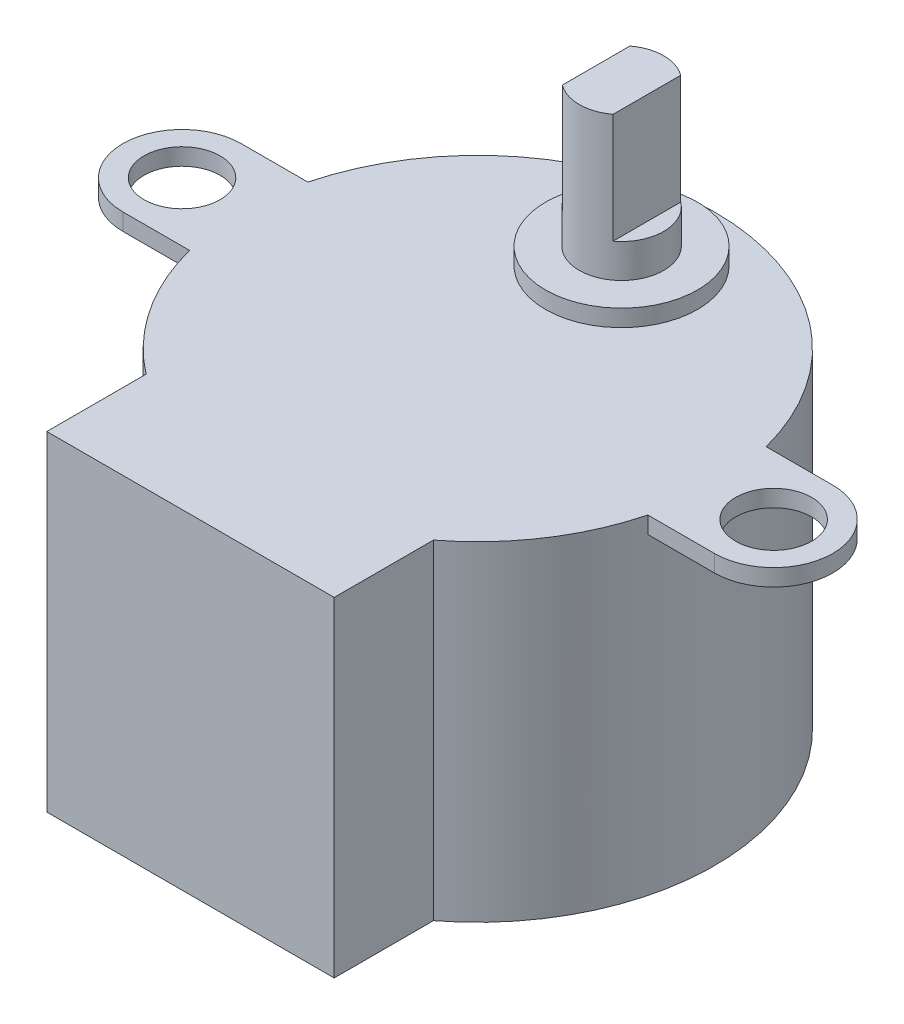
ISO-10303-21;
HEADER;
FILE_DESCRIPTION(('STEP AP214'),'2;1');
FILE_NAME('part.step','',(''),(''),'','','');
FILE_SCHEMA(('AUTOMOTIVE_DESIGN { 1 0 10303 214 1 1 1 1 }'));
ENDSEC;
DATA;
#1=APPLICATION_CONTEXT('core data for automotive mechanical design processes');
#2=APPLICATION_PROTOCOL_DEFINITION('international standard','automotive_design',2000,#1);
#3=PRODUCT_CONTEXT('',#1,'mechanical');
#4=PRODUCT('Part','Part','',(#3));
#5=PRODUCT_RELATED_PRODUCT_CATEGORY('part','',(#4));
#6=PRODUCT_DEFINITION_FORMATION('','',#4);
#7=PRODUCT_DEFINITION_CONTEXT('part definition',#1,'design');
#8=PRODUCT_DEFINITION('design','',#6,#7);
#9=PRODUCT_DEFINITION_SHAPE('','',#8);
#10=(LENGTH_UNIT() NAMED_UNIT(*) SI_UNIT(.MILLI.,.METRE.));
#11=(NAMED_UNIT(*) PLANE_ANGLE_UNIT() SI_UNIT($,.RADIAN.));
#12=(NAMED_UNIT(*) SI_UNIT($,.STERADIAN.) SOLID_ANGLE_UNIT());
#13=UNCERTAINTY_MEASURE_WITH_UNIT(LENGTH_MEASURE(1.E-05),#10,'distance_accuracy_value','');
#14=(GEOMETRIC_REPRESENTATION_CONTEXT(3) GLOBAL_UNCERTAINTY_ASSIGNED_CONTEXT((#13)) GLOBAL_UNIT_ASSIGNED_CONTEXT((#10,
#11,#12)) REPRESENTATION_CONTEXT('',''));
#15=CARTESIAN_POINT('',(0.,0.,0.));
#16=DIRECTION('',(0.,0.,1.));
#17=DIRECTION('',(1.,0.,0.));
#18=AXIS2_PLACEMENT_3D('',#15,#16,#17);
#19=CARTESIAN_POINT('',(0.,22.5,-8.5));
#20=DIRECTION('',(0.,1.,0.));
#21=DIRECTION('',(0.,0.,1.));
#22=AXIS2_PLACEMENT_3D('',#19,#20,#21);
#23=PLANE('',#22);
#24=CARTESIAN_POINT('',(0.,22.5,-8.5));
#25=DIRECTION('',(0.,1.,0.));
#26=DIRECTION('',(0.,0.,1.));
#27=AXIS2_PLACEMENT_3D('',#24,#25,#26);
#28=CIRCLE('',#27,2.5);
#29=CARTESIAN_POINT('',(1.5,22.5,-6.5));
#30=VERTEX_POINT('',#29);
#31=CARTESIAN_POINT('',(1.5,22.5,-10.5));
#32=VERTEX_POINT('',#31);
#33=EDGE_CURVE('E93',#30,#32,#28,.T.);
#34=ORIENTED_EDGE('',*,*,#33,.T.);
#35=DIRECTION('',(0.,0.,1.));
#36=VECTOR('',#35,1.);
#37=CARTESIAN_POINT('',(1.5,22.5,-8.5));
#38=LINE('',#37,#36);
#39=EDGE_CURVE('E203',#32,#30,#38,.T.);
#40=ORIENTED_EDGE('',*,*,#39,.T.);
#41=EDGE_LOOP('',(#34,#40));
#42=FACE_BOUND('',#41,.T.);
#43=ADVANCED_FACE('F71',(#42),#23,.T.);
#44=CARTESIAN_POINT('',(0.,19.5,0.));
#45=DIRECTION('',(0.,-1.,0.));
#46=DIRECTION('',(0.,0.,-1.));
#47=AXIS2_PLACEMENT_3D('',#44,#45,#46);
#48=CYLINDRICAL_SURFACE('',#47,14.);
#49=CARTESIAN_POINT('',(0.,19.5,0.));
#50=DIRECTION('',(0.,1.,0.));
#51=DIRECTION('',(0.,0.,1.));
#52=AXIS2_PLACEMENT_3D('',#49,#50,#51);
#53=CIRCLE('',#52,14.);
#54=CARTESIAN_POINT('',(-13.555441711726,19.5,3.5));
#55=VERTEX_POINT('',#54);
#56=CARTESIAN_POINT('',(-8.5,19.5,11.1242977306435));
#57=VERTEX_POINT('',#56);
#58=EDGE_CURVE('E292',#55,#57,#53,.T.);
#59=ORIENTED_EDGE('',*,*,#58,.F.);
#60=DIRECTION('',(0.,1.,0.));
#61=VECTOR('',#60,1.);
#62=CARTESIAN_POINT('',(-13.555441711726,18.5,3.5));
#63=LINE('',#62,#61);
#64=CARTESIAN_POINT('',(-13.555441711726,18.5,3.5));
#65=VERTEX_POINT('',#64);
#66=EDGE_CURVE('E250',#65,#55,#63,.T.);
#67=ORIENTED_EDGE('',*,*,#66,.F.);
#68=CARTESIAN_POINT('',(0.,18.5,0.));
#69=DIRECTION('',(0.,1.,0.));
#70=DIRECTION('',(0.,0.,1.));
#71=AXIS2_PLACEMENT_3D('',#68,#69,#70);
#72=CIRCLE('',#71,14.);
#73=CARTESIAN_POINT('',(-13.555441711726,18.5,-3.5));
#74=VERTEX_POINT('',#73);
#75=EDGE_CURVE('E227',#74,#65,#72,.T.);
#76=ORIENTED_EDGE('',*,*,#75,.F.);
#77=DIRECTION('',(0.,1.,0.));
#78=VECTOR('',#77,1.);
#79=CARTESIAN_POINT('',(-13.555441711726,18.5,-3.5));
#80=LINE('',#79,#78);
#81=CARTESIAN_POINT('',(-13.555441711726,19.5,-3.5));
#82=VERTEX_POINT('',#81);
#83=EDGE_CURVE('E238',#74,#82,#80,.T.);
#84=ORIENTED_EDGE('',*,*,#83,.T.);
#85=CARTESIAN_POINT('',(13.555441711726,19.5,-3.5));
#86=VERTEX_POINT('',#85);
#87=EDGE_CURVE('E298',#86,#82,#53,.T.);
#88=ORIENTED_EDGE('',*,*,#87,.F.);
#89=DIRECTION('',(0.,1.,0.));
#90=VECTOR('',#89,1.);
#91=CARTESIAN_POINT('',(13.555441711726,18.5,-3.5));
#92=LINE('',#91,#90);
#93=CARTESIAN_POINT('',(13.555441711726,18.5,-3.5));
#94=VERTEX_POINT('',#93);
#95=EDGE_CURVE('E271',#94,#86,#92,.T.);
#96=ORIENTED_EDGE('',*,*,#95,.F.);
#97=CARTESIAN_POINT('',(0.,18.5,0.));
#98=DIRECTION('',(0.,1.,0.));
#99=DIRECTION('',(0.,0.,1.));
#100=AXIS2_PLACEMENT_3D('',#97,#98,#99);
#101=CIRCLE('',#100,14.);
#102=CARTESIAN_POINT('',(13.555441711726,18.5,3.5));
#103=VERTEX_POINT('',#102);
#104=EDGE_CURVE('E269',#103,#94,#101,.T.);
#105=ORIENTED_EDGE('',*,*,#104,.F.);
#106=DIRECTION('',(0.,1.,0.));
#107=VECTOR('',#106,1.);
#108=CARTESIAN_POINT('',(13.555441711726,18.5,3.5));
#109=LINE('',#108,#107);
#110=CARTESIAN_POINT('',(13.555441711726,19.5,3.5));
#111=VERTEX_POINT('',#110);
#112=EDGE_CURVE('E281',#103,#111,#109,.T.);
#113=ORIENTED_EDGE('',*,*,#112,.T.);
#114=CARTESIAN_POINT('',(8.5,19.5,11.1242977306435));
#115=VERTEX_POINT('',#114);
#116=EDGE_CURVE('E294',#115,#111,#53,.T.);
#117=ORIENTED_EDGE('',*,*,#116,.F.);
#118=DIRECTION('',(0.,-1.,0.));
#119=VECTOR('',#118,1.);
#120=CARTESIAN_POINT('',(8.5,19.5,11.1242977306435));
#121=LINE('',#120,#119);
#122=CARTESIAN_POINT('',(8.5,0.,11.1242977306435));
#123=VERTEX_POINT('',#122);
#124=EDGE_CURVE('E75',#115,#123,#121,.T.);
#125=ORIENTED_EDGE('',*,*,#124,.T.);
#126=CARTESIAN_POINT('',(0.,0.,0.));
#127=DIRECTION('',(0.,1.,0.));
#128=DIRECTION('',(0.,0.,1.));
#129=AXIS2_PLACEMENT_3D('',#126,#127,#128);
#130=CIRCLE('',#129,14.);
#131=CARTESIAN_POINT('',(-8.5,0.,11.1242977306435));
#132=VERTEX_POINT('',#131);
#133=EDGE_CURVE('E307',#123,#132,#130,.T.);
#134=ORIENTED_EDGE('',*,*,#133,.T.);
#135=DIRECTION('',(0.,-1.,0.));
#136=VECTOR('',#135,1.);
#137=CARTESIAN_POINT('',(-8.5,19.5,11.1242977306435));
#138=LINE('',#137,#136);
#139=EDGE_CURVE('E317',#57,#132,#138,.T.);
#140=ORIENTED_EDGE('',*,*,#139,.F.);
#141=EDGE_LOOP('',(#59,#67,#76,#84,#88,#96,#105,#113,#117,#125,#134,#140));
#142=FACE_BOUND('',#141,.T.);
#143=ADVANCED_FACE('F325',(#142),#48,.T.);
#144=CARTESIAN_POINT('',(8.5,19.5,0.));
#145=DIRECTION('',(-1.,0.,0.));
#146=DIRECTION('',(0.,0.,1.));
#147=AXIS2_PLACEMENT_3D('',#144,#145,#146);
#148=PLANE('',#147);
#149=DIRECTION('',(0.,0.,-1.));
#150=VECTOR('',#149,1.);
#151=CARTESIAN_POINT('',(8.5,0.,0.));
#152=LINE('',#151,#150);
#153=CARTESIAN_POINT('',(8.5,0.,17.));
#154=VERTEX_POINT('',#153);
#155=EDGE_CURVE('E288',#154,#123,#152,.T.);
#156=ORIENTED_EDGE('',*,*,#155,.T.);
#157=ORIENTED_EDGE('',*,*,#124,.F.);
#158=DIRECTION('',(0.,0.,-1.));
#159=VECTOR('',#158,1.);
#160=CARTESIAN_POINT('',(8.5,19.5,0.));
#161=LINE('',#160,#159);
#162=CARTESIAN_POINT('',(8.5,19.5,17.));
#163=VERTEX_POINT('',#162);
#164=EDGE_CURVE('E289',#163,#115,#161,.T.);
#165=ORIENTED_EDGE('',*,*,#164,.F.);
#166=DIRECTION('',(0.,-1.,0.));
#167=VECTOR('',#166,1.);
#168=CARTESIAN_POINT('',(8.5,19.5,17.));
#169=LINE('',#168,#167);
#170=EDGE_CURVE('E304',#163,#154,#169,.T.);
#171=ORIENTED_EDGE('',*,*,#170,.T.);
#172=EDGE_LOOP('',(#156,#157,#165,#171));
#173=FACE_BOUND('',#172,.T.);
#174=ADVANCED_FACE('F73',(#173),#148,.F.);
#175=CARTESIAN_POINT('',(-8.5,19.5,0.));
#176=DIRECTION('',(-1.,0.,0.));
#177=DIRECTION('',(0.,0.,1.));
#178=AXIS2_PLACEMENT_3D('',#175,#176,#177);
#179=PLANE('',#178);
#180=DIRECTION('',(0.,0.,-1.));
#181=VECTOR('',#180,1.);
#182=CARTESIAN_POINT('',(-8.5,0.,0.));
#183=LINE('',#182,#181);
#184=CARTESIAN_POINT('',(-8.5,0.,17.));
#185=VERTEX_POINT('',#184);
#186=EDGE_CURVE('E310',#185,#132,#183,.T.);
#187=ORIENTED_EDGE('',*,*,#186,.F.);
#188=DIRECTION('',(0.,-1.,0.));
#189=VECTOR('',#188,1.);
#190=CARTESIAN_POINT('',(-8.5,19.5,17.));
#191=LINE('',#190,#189);
#192=CARTESIAN_POINT('',(-8.5,19.5,17.));
#193=VERTEX_POINT('',#192);
#194=EDGE_CURVE('E316',#193,#185,#191,.T.);
#195=ORIENTED_EDGE('',*,*,#194,.F.);
#196=DIRECTION('',(0.,0.,-1.));
#197=VECTOR('',#196,1.);
#198=CARTESIAN_POINT('',(-8.5,19.5,0.));
#199=LINE('',#198,#197);
#200=EDGE_CURVE('E297',#193,#57,#199,.T.);
#201=ORIENTED_EDGE('',*,*,#200,.T.);
#202=ORIENTED_EDGE('',*,*,#139,.T.);
#203=EDGE_LOOP('',(#187,#195,#201,#202));
#204=FACE_BOUND('',#203,.T.);
#205=ADVANCED_FACE('F336',(#204),#179,.T.);
#206=CARTESIAN_POINT('',(0.,19.5,17.));
#207=DIRECTION('',(0.,0.,1.));
#208=DIRECTION('',(1.,0.,0.));
#209=AXIS2_PLACEMENT_3D('',#206,#207,#208);
#210=PLANE('',#209);
#211=DIRECTION('',(-1.,0.,0.));
#212=VECTOR('',#211,1.);
#213=CARTESIAN_POINT('',(0.,0.,17.));
#214=LINE('',#213,#212);
#215=EDGE_CURVE('E293',#154,#185,#214,.T.);
#216=ORIENTED_EDGE('',*,*,#215,.F.);
#217=ORIENTED_EDGE('',*,*,#170,.F.);
#218=DIRECTION('',(-1.,0.,0.));
#219=VECTOR('',#218,1.);
#220=CARTESIAN_POINT('',(0.,19.5,17.));
#221=LINE('',#220,#219);
#222=EDGE_CURVE('E301',#163,#193,#221,.T.);
#223=ORIENTED_EDGE('',*,*,#222,.T.);
#224=ORIENTED_EDGE('',*,*,#194,.T.);
#225=EDGE_LOOP('',(#216,#217,#223,#224));
#226=FACE_BOUND('',#225,.T.);
#227=ADVANCED_FACE('F333',(#226),#210,.T.);
#228=CARTESIAN_POINT('',(0.,19.5,0.));
#229=DIRECTION('',(0.,1.,0.));
#230=DIRECTION('',(0.,0.,1.));
#231=AXIS2_PLACEMENT_3D('',#228,#229,#230);
#232=PLANE('',#231);
#233=CARTESIAN_POINT('',(0.,19.5,-8.5));
#234=DIRECTION('',(0.,1.,0.));
#235=DIRECTION('',(0.,0.,1.));
#236=AXIS2_PLACEMENT_3D('',#233,#234,#235);
#237=CIRCLE('',#236,4.5);
#238=CARTESIAN_POINT('',(0.,19.5,-4.));
#239=VERTEX_POINT('',#238);
#240=EDGE_CURVE('E213',#239,#239,#237,.T.);
#241=ORIENTED_EDGE('',*,*,#240,.F.);
#242=EDGE_LOOP('',(#241));
#243=FACE_BOUND('',#242,.T.);
#244=ORIENTED_EDGE('',*,*,#164,.T.);
#245=ORIENTED_EDGE('',*,*,#116,.T.);
#246=DIRECTION('',(1.,0.,0.));
#247=VECTOR('',#246,1.);
#248=CARTESIAN_POINT('',(0.,19.5,3.5));
#249=LINE('',#248,#247);
#250=CARTESIAN_POINT('',(17.5,19.5,3.5));
#251=VERTEX_POINT('',#250);
#252=EDGE_CURVE('E263',#111,#251,#249,.T.);
#253=ORIENTED_EDGE('',*,*,#252,.T.);
#254=CARTESIAN_POINT('',(17.5,19.5,0.));
#255=DIRECTION('',(0.,1.,0.));
#256=DIRECTION('',(0.,0.,1.));
#257=AXIS2_PLACEMENT_3D('',#254,#255,#256);
#258=CIRCLE('',#257,3.5);
#259=CARTESIAN_POINT('',(17.5,19.5,-3.5));
#260=VERTEX_POINT('',#259);
#261=EDGE_CURVE('E274',#251,#260,#258,.T.);
#262=ORIENTED_EDGE('',*,*,#261,.T.);
#263=DIRECTION('',(1.,0.,0.));
#264=VECTOR('',#263,1.);
#265=CARTESIAN_POINT('',(0.,19.5,-3.5));
#266=LINE('',#265,#264);
#267=EDGE_CURVE('E257',#86,#260,#266,.T.);
#268=ORIENTED_EDGE('',*,*,#267,.F.);
#269=ORIENTED_EDGE('',*,*,#87,.T.);
#270=DIRECTION('',(1.,0.,0.));
#271=VECTOR('',#270,1.);
#272=CARTESIAN_POINT('',(0.,19.5,-3.5));
#273=LINE('',#272,#271);
#274=CARTESIAN_POINT('',(-17.5,19.5,-3.5));
#275=VERTEX_POINT('',#274);
#276=EDGE_CURVE('E230',#275,#82,#273,.T.);
#277=ORIENTED_EDGE('',*,*,#276,.F.);
#278=CARTESIAN_POINT('',(-17.5,19.5,0.));
#279=DIRECTION('',(0.,1.,0.));
#280=DIRECTION('',(0.,0.,1.));
#281=AXIS2_PLACEMENT_3D('',#278,#279,#280);
#282=CIRCLE('',#281,3.5);
#283=CARTESIAN_POINT('',(-17.5,19.5,3.5));
#284=VERTEX_POINT('',#283);
#285=EDGE_CURVE('E240',#275,#284,#282,.T.);
#286=ORIENTED_EDGE('',*,*,#285,.T.);
#287=DIRECTION('',(1.,0.,0.));
#288=VECTOR('',#287,1.);
#289=CARTESIAN_POINT('',(0.,19.5,3.5));
#290=LINE('',#289,#288);
#291=EDGE_CURVE('E224',#284,#55,#290,.T.);
#292=ORIENTED_EDGE('',*,*,#291,.T.);
#293=ORIENTED_EDGE('',*,*,#58,.T.);
#294=ORIENTED_EDGE('',*,*,#200,.F.);
#295=ORIENTED_EDGE('',*,*,#222,.F.);
#296=EDGE_LOOP('',(#244,#245,#253,#262,#268,#269,#277,#286,#292,#293,#294,#295));
#297=FACE_BOUND('',#296,.T.);
#298=CARTESIAN_POINT('',(17.5,19.5,0.));
#299=DIRECTION('',(0.,1.,0.));
#300=DIRECTION('',(0.,0.,1.));
#301=AXIS2_PLACEMENT_3D('',#298,#299,#300);
#302=CIRCLE('',#301,2.25);
#303=CARTESIAN_POINT('',(17.5,19.5,2.25));
#304=VERTEX_POINT('',#303);
#305=EDGE_CURVE('E253',#304,#304,#302,.T.);
#306=ORIENTED_EDGE('',*,*,#305,.F.);
#307=EDGE_LOOP('',(#306));
#308=FACE_BOUND('',#307,.T.);
#309=CARTESIAN_POINT('',(-17.5,19.5,0.));
#310=DIRECTION('',(0.,1.,0.));
#311=DIRECTION('',(0.,0.,1.));
#312=AXIS2_PLACEMENT_3D('',#309,#310,#311);
#313=CIRCLE('',#312,2.25);
#314=CARTESIAN_POINT('',(-17.5,19.5,2.25));
#315=VERTEX_POINT('',#314);
#316=EDGE_CURVE('E218',#315,#315,#313,.T.);
#317=ORIENTED_EDGE('',*,*,#316,.F.);
#318=EDGE_LOOP('',(#317));
#319=FACE_BOUND('',#318,.T.);
#320=ADVANCED_FACE('F343',(#243,#297,#308,#319),#232,.T.);
#321=CARTESIAN_POINT('',(0.,0.,0.));
#322=DIRECTION('',(0.,1.,0.));
#323=DIRECTION('',(0.,0.,1.));
#324=AXIS2_PLACEMENT_3D('',#321,#322,#323);
#325=PLANE('',#324);
#326=ORIENTED_EDGE('',*,*,#155,.F.);
#327=ORIENTED_EDGE('',*,*,#215,.T.);
#328=ORIENTED_EDGE('',*,*,#186,.T.);
#329=ORIENTED_EDGE('',*,*,#133,.F.);
#330=EDGE_LOOP('',(#326,#327,#328,#329));
#331=FACE_BOUND('',#330,.T.);
#332=ADVANCED_FACE('F331',(#331),#325,.F.);
#333=CARTESIAN_POINT('',(0.,18.5,-3.5));
#334=DIRECTION('',(0.,0.,1.));
#335=DIRECTION('',(1.,0.,0.));
#336=AXIS2_PLACEMENT_3D('',#333,#334,#335);
#337=PLANE('',#336);
#338=ORIENTED_EDGE('',*,*,#267,.T.);
#339=DIRECTION('',(0.,1.,0.));
#340=VECTOR('',#339,1.);
#341=CARTESIAN_POINT('',(17.5,18.5,-3.5));
#342=LINE('',#341,#340);
#343=CARTESIAN_POINT('',(17.5,18.5,-3.5));
#344=VERTEX_POINT('',#343);
#345=EDGE_CURVE('E286',#344,#260,#342,.T.);
#346=ORIENTED_EDGE('',*,*,#345,.F.);
#347=DIRECTION('',(1.,0.,0.));
#348=VECTOR('',#347,1.);
#349=CARTESIAN_POINT('',(0.,18.5,-3.5));
#350=LINE('',#349,#348);
#351=EDGE_CURVE('E260',#94,#344,#350,.T.);
#352=ORIENTED_EDGE('',*,*,#351,.F.);
#353=ORIENTED_EDGE('',*,*,#95,.T.);
#354=EDGE_LOOP('',(#338,#346,#352,#353));
#355=FACE_BOUND('',#354,.T.);
#356=ADVANCED_FACE('F405',(#355),#337,.F.);
#357=CARTESIAN_POINT('',(17.5,18.5,0.));
#358=DIRECTION('',(0.,1.,0.));
#359=DIRECTION('',(0.,0.,1.));
#360=AXIS2_PLACEMENT_3D('',#357,#358,#359);
#361=CYLINDRICAL_SURFACE('',#360,3.5);
#362=ORIENTED_EDGE('',*,*,#261,.F.);
#363=DIRECTION('',(0.,1.,0.));
#364=VECTOR('',#363,1.);
#365=CARTESIAN_POINT('',(17.5,18.5,3.5));
#366=LINE('',#365,#364);
#367=CARTESIAN_POINT('',(17.5,18.5,3.5));
#368=VERTEX_POINT('',#367);
#369=EDGE_CURVE('E284',#368,#251,#366,.T.);
#370=ORIENTED_EDGE('',*,*,#369,.F.);
#371=CARTESIAN_POINT('',(17.5,18.5,0.));
#372=DIRECTION('',(0.,1.,0.));
#373=DIRECTION('',(0.,0.,1.));
#374=AXIS2_PLACEMENT_3D('',#371,#372,#373);
#375=CIRCLE('',#374,3.5);
#376=EDGE_CURVE('E262',#368,#344,#375,.T.);
#377=ORIENTED_EDGE('',*,*,#376,.T.);
#378=ORIENTED_EDGE('',*,*,#345,.T.);
#379=EDGE_LOOP('',(#362,#370,#377,#378));
#380=FACE_BOUND('',#379,.T.);
#381=ADVANCED_FACE('F401',(#380),#361,.T.);
#382=CARTESIAN_POINT('',(0.,18.5,3.5));
#383=DIRECTION('',(0.,0.,1.));
#384=DIRECTION('',(1.,0.,0.));
#385=AXIS2_PLACEMENT_3D('',#382,#383,#384);
#386=PLANE('',#385);
#387=ORIENTED_EDGE('',*,*,#252,.F.);
#388=ORIENTED_EDGE('',*,*,#112,.F.);
#389=DIRECTION('',(1.,0.,0.));
#390=VECTOR('',#389,1.);
#391=CARTESIAN_POINT('',(0.,18.5,3.5));
#392=LINE('',#391,#390);
#393=EDGE_CURVE('E266',#103,#368,#392,.T.);
#394=ORIENTED_EDGE('',*,*,#393,.T.);
#395=ORIENTED_EDGE('',*,*,#369,.T.);
#396=EDGE_LOOP('',(#387,#388,#394,#395));
#397=FACE_BOUND('',#396,.T.);
#398=ADVANCED_FACE('F397',(#397),#386,.T.);
#399=CARTESIAN_POINT('',(17.5,18.5,0.));
#400=DIRECTION('',(0.,1.,0.));
#401=DIRECTION('',(0.,0.,1.));
#402=AXIS2_PLACEMENT_3D('',#399,#400,#401);
#403=PLANE('',#402);
#404=CARTESIAN_POINT('',(17.5,18.5,0.));
#405=DIRECTION('',(0.,1.,0.));
#406=DIRECTION('',(0.,0.,1.));
#407=AXIS2_PLACEMENT_3D('',#404,#405,#406);
#408=CIRCLE('',#407,2.25);
#409=CARTESIAN_POINT('',(17.5,18.5,2.25));
#410=VERTEX_POINT('',#409);
#411=EDGE_CURVE('E254',#410,#410,#408,.T.);
#412=ORIENTED_EDGE('',*,*,#411,.T.);
#413=EDGE_LOOP('',(#412));
#414=FACE_BOUND('',#413,.T.);
#415=ORIENTED_EDGE('',*,*,#351,.T.);
#416=ORIENTED_EDGE('',*,*,#376,.F.);
#417=ORIENTED_EDGE('',*,*,#393,.F.);
#418=ORIENTED_EDGE('',*,*,#104,.T.);
#419=EDGE_LOOP('',(#415,#416,#417,#418));
#420=FACE_BOUND('',#419,.T.);
#421=ADVANCED_FACE('F393',(#414,#420),#403,.F.);
#422=CARTESIAN_POINT('',(17.5,18.5,0.));
#423=DIRECTION('',(0.,1.,0.));
#424=DIRECTION('',(0.,0.,1.));
#425=AXIS2_PLACEMENT_3D('',#422,#423,#424);
#426=CYLINDRICAL_SURFACE('',#425,2.25);
#427=ORIENTED_EDGE('',*,*,#411,.F.);
#428=EDGE_LOOP('',(#427));
#429=FACE_BOUND('',#428,.T.);
#430=ORIENTED_EDGE('',*,*,#305,.T.);
#431=EDGE_LOOP('',(#430));
#432=FACE_BOUND('',#431,.T.);
#433=ADVANCED_FACE('F389',(#429,#432),#426,.F.);
#434=CARTESIAN_POINT('',(0.,18.5,3.5));
#435=DIRECTION('',(0.,0.,1.));
#436=DIRECTION('',(1.,0.,0.));
#437=AXIS2_PLACEMENT_3D('',#434,#435,#436);
#438=PLANE('',#437);
#439=ORIENTED_EDGE('',*,*,#291,.F.);
#440=DIRECTION('',(0.,1.,0.));
#441=VECTOR('',#440,1.);
#442=CARTESIAN_POINT('',(-17.5,18.5,3.5));
#443=LINE('',#442,#441);
#444=CARTESIAN_POINT('',(-17.5,18.5,3.5));
#445=VERTEX_POINT('',#444);
#446=EDGE_CURVE('E248',#445,#284,#443,.T.);
#447=ORIENTED_EDGE('',*,*,#446,.F.);
#448=DIRECTION('',(1.,0.,0.));
#449=VECTOR('',#448,1.);
#450=CARTESIAN_POINT('',(0.,18.5,3.5));
#451=LINE('',#450,#449);
#452=EDGE_CURVE('E229',#445,#65,#451,.T.);
#453=ORIENTED_EDGE('',*,*,#452,.T.);
#454=ORIENTED_EDGE('',*,*,#66,.T.);
#455=EDGE_LOOP('',(#439,#447,#453,#454));
#456=FACE_BOUND('',#455,.T.);
#457=ADVANCED_FACE('F385',(#456),#438,.T.);
#458=CARTESIAN_POINT('',(-17.5,18.5,0.));
#459=DIRECTION('',(0.,1.,0.));
#460=DIRECTION('',(0.,0.,1.));
#461=AXIS2_PLACEMENT_3D('',#458,#459,#460);
#462=CYLINDRICAL_SURFACE('',#461,3.5);
#463=ORIENTED_EDGE('',*,*,#285,.F.);
#464=DIRECTION('',(0.,1.,0.));
#465=VECTOR('',#464,1.);
#466=CARTESIAN_POINT('',(-17.5,18.5,-3.5));
#467=LINE('',#466,#465);
#468=CARTESIAN_POINT('',(-17.5,18.5,-3.5));
#469=VERTEX_POINT('',#468);
#470=EDGE_CURVE('E246',#469,#275,#467,.T.);
#471=ORIENTED_EDGE('',*,*,#470,.F.);
#472=CARTESIAN_POINT('',(-17.5,18.5,0.));
#473=DIRECTION('',(0.,1.,0.));
#474=DIRECTION('',(0.,0.,1.));
#475=AXIS2_PLACEMENT_3D('',#472,#473,#474);
#476=CIRCLE('',#475,3.5);
#477=EDGE_CURVE('E233',#469,#445,#476,.T.);
#478=ORIENTED_EDGE('',*,*,#477,.T.);
#479=ORIENTED_EDGE('',*,*,#446,.T.);
#480=EDGE_LOOP('',(#463,#471,#478,#479));
#481=FACE_BOUND('',#480,.T.);
#482=ADVANCED_FACE('F381',(#481),#462,.T.);
#483=CARTESIAN_POINT('',(0.,18.5,-3.5));
#484=DIRECTION('',(0.,0.,1.));
#485=DIRECTION('',(1.,0.,0.));
#486=AXIS2_PLACEMENT_3D('',#483,#484,#485);
#487=PLANE('',#486);
#488=ORIENTED_EDGE('',*,*,#276,.T.);
#489=ORIENTED_EDGE('',*,*,#83,.F.);
#490=DIRECTION('',(1.,0.,0.));
#491=VECTOR('',#490,1.);
#492=CARTESIAN_POINT('',(0.,18.5,-3.5));
#493=LINE('',#492,#491);
#494=EDGE_CURVE('E236',#469,#74,#493,.T.);
#495=ORIENTED_EDGE('',*,*,#494,.F.);
#496=ORIENTED_EDGE('',*,*,#470,.T.);
#497=EDGE_LOOP('',(#488,#489,#495,#496));
#498=FACE_BOUND('',#497,.T.);
#499=ADVANCED_FACE('F377',(#498),#487,.F.);
#500=CARTESIAN_POINT('',(0.,18.5,0.));
#501=DIRECTION('',(0.,1.,0.));
#502=DIRECTION('',(0.,0.,1.));
#503=AXIS2_PLACEMENT_3D('',#500,#501,#502);
#504=PLANE('',#503);
#505=CARTESIAN_POINT('',(-17.5,18.5,0.));
#506=DIRECTION('',(0.,1.,0.));
#507=DIRECTION('',(0.,0.,1.));
#508=AXIS2_PLACEMENT_3D('',#505,#506,#507);
#509=CIRCLE('',#508,2.25);
#510=CARTESIAN_POINT('',(-17.5,18.5,2.25));
#511=VERTEX_POINT('',#510);
#512=EDGE_CURVE('E221',#511,#511,#509,.T.);
#513=ORIENTED_EDGE('',*,*,#512,.T.);
#514=EDGE_LOOP('',(#513));
#515=FACE_BOUND('',#514,.T.);
#516=ORIENTED_EDGE('',*,*,#75,.T.);
#517=ORIENTED_EDGE('',*,*,#452,.F.);
#518=ORIENTED_EDGE('',*,*,#477,.F.);
#519=ORIENTED_EDGE('',*,*,#494,.T.);
#520=EDGE_LOOP('',(#516,#517,#518,#519));
#521=FACE_BOUND('',#520,.T.);
#522=ADVANCED_FACE('F373',(#515,#521),#504,.F.);
#523=CARTESIAN_POINT('',(-17.5,18.5,0.));
#524=DIRECTION('',(0.,1.,0.));
#525=DIRECTION('',(0.,0.,1.));
#526=AXIS2_PLACEMENT_3D('',#523,#524,#525);
#527=CYLINDRICAL_SURFACE('',#526,2.25);
#528=ORIENTED_EDGE('',*,*,#512,.F.);
#529=EDGE_LOOP('',(#528));
#530=FACE_BOUND('',#529,.T.);
#531=ORIENTED_EDGE('',*,*,#316,.T.);
#532=EDGE_LOOP('',(#531));
#533=FACE_BOUND('',#532,.T.);
#534=ADVANCED_FACE('F369',(#530,#533),#527,.F.);
#535=CARTESIAN_POINT('',(0.,20.5,-8.5));
#536=DIRECTION('',(0.,-1.,0.));
#537=DIRECTION('',(0.,0.,-1.));
#538=AXIS2_PLACEMENT_3D('',#535,#536,#537);
#539=CYLINDRICAL_SURFACE('',#538,4.5);
#540=CARTESIAN_POINT('',(0.,20.5,-8.5));
#541=DIRECTION('',(0.,1.,0.));
#542=DIRECTION('',(0.,0.,1.));
#543=AXIS2_PLACEMENT_3D('',#540,#541,#542);
#544=CIRCLE('',#543,4.5);
#545=CARTESIAN_POINT('',(0.,20.5,-4.));
#546=VERTEX_POINT('',#545);
#547=EDGE_CURVE('E215',#546,#546,#544,.T.);
#548=ORIENTED_EDGE('',*,*,#547,.F.);
#549=EDGE_LOOP('',(#548));
#550=FACE_BOUND('',#549,.T.);
#551=ORIENTED_EDGE('',*,*,#240,.T.);
#552=EDGE_LOOP('',(#551));
#553=FACE_BOUND('',#552,.T.);
#554=ADVANCED_FACE('F363',(#550,#553),#539,.T.);
#555=CARTESIAN_POINT('',(0.,20.5,-8.5));
#556=DIRECTION('',(0.,1.,0.));
#557=DIRECTION('',(0.,0.,1.));
#558=AXIS2_PLACEMENT_3D('',#555,#556,#557);
#559=PLANE('',#558);
#560=CARTESIAN_POINT('',(0.,20.5,-8.5));
#561=DIRECTION('',(0.,1.,0.));
#562=DIRECTION('',(0.,0.,1.));
#563=AXIS2_PLACEMENT_3D('',#560,#561,#562);
#564=CIRCLE('',#563,2.5);
#565=CARTESIAN_POINT('',(0.,20.5,-6.));
#566=VERTEX_POINT('',#565);
#567=EDGE_CURVE('E12',#566,#566,#564,.T.);
#568=ORIENTED_EDGE('',*,*,#567,.F.);
#569=EDGE_LOOP('',(#568));
#570=FACE_BOUND('',#569,.T.);
#571=ORIENTED_EDGE('',*,*,#547,.T.);
#572=EDGE_LOOP('',(#571));
#573=FACE_BOUND('',#572,.T.);
#574=ADVANCED_FACE('F360',(#570,#573),#559,.T.);
#575=CARTESIAN_POINT('',(0.,22.5,-8.5));
#576=DIRECTION('',(0.,-1.,0.));
#577=DIRECTION('',(0.,0.,-1.));
#578=AXIS2_PLACEMENT_3D('',#575,#576,#577);
#579=CYLINDRICAL_SURFACE('',#578,2.5);
#580=ORIENTED_EDGE('',*,*,#33,.F.);
#581=DIRECTION('',(0.,-1.,0.));
#582=VECTOR('',#581,1.);
#583=CARTESIAN_POINT('',(1.5,29.,-6.5));
#584=LINE('',#583,#582);
#585=CARTESIAN_POINT('',(1.5,29.,-6.5));
#586=VERTEX_POINT('',#585);
#587=EDGE_CURVE('E210',#586,#30,#584,.T.);
#588=ORIENTED_EDGE('',*,*,#587,.F.);
#589=CARTESIAN_POINT('',(0.,29.,-8.5));
#590=DIRECTION('',(0.,1.,0.));
#591=DIRECTION('',(0.,0.,1.));
#592=AXIS2_PLACEMENT_3D('',#589,#590,#591);
#593=CIRCLE('',#592,2.5);
#594=CARTESIAN_POINT('',(-1.5,29.,-6.5));
#595=VERTEX_POINT('',#594);
#596=EDGE_CURVE('E194',#595,#586,#593,.T.);
#597=ORIENTED_EDGE('',*,*,#596,.F.);
#598=DIRECTION('',(0.,-1.,0.));
#599=VECTOR('',#598,1.);
#600=CARTESIAN_POINT('',(-1.5,29.,-6.5));
#601=LINE('',#600,#599);
#602=CARTESIAN_POINT('',(-1.5,22.5,-6.5));
#603=VERTEX_POINT('',#602);
#604=EDGE_CURVE('E191',#595,#603,#601,.T.);
#605=ORIENTED_EDGE('',*,*,#604,.T.);
#606=CARTESIAN_POINT('',(-1.5,22.5,-10.5));
#607=VERTEX_POINT('',#606);
#608=EDGE_CURVE('E207',#607,#603,#28,.T.);
#609=ORIENTED_EDGE('',*,*,#608,.F.);
#610=DIRECTION('',(0.,-1.,0.));
#611=VECTOR('',#610,1.);
#612=CARTESIAN_POINT('',(-1.5,29.,-10.5));
#613=LINE('',#612,#611);
#614=CARTESIAN_POINT('',(-1.5,29.,-10.5));
#615=VERTEX_POINT('',#614);
#616=EDGE_CURVE('E189',#615,#607,#613,.T.);
#617=ORIENTED_EDGE('',*,*,#616,.F.);
#618=CARTESIAN_POINT('',(0.,29.,-8.5));
#619=DIRECTION('',(0.,1.,0.));
#620=DIRECTION('',(0.,0.,1.));
#621=AXIS2_PLACEMENT_3D('',#618,#619,#620);
#622=CIRCLE('',#621,2.5);
#623=CARTESIAN_POINT('',(1.5,29.,-10.5));
#624=VERTEX_POINT('',#623);
#625=EDGE_CURVE('E195',#624,#615,#622,.T.);
#626=ORIENTED_EDGE('',*,*,#625,.F.);
#627=DIRECTION('',(0.,-1.,0.));
#628=VECTOR('',#627,1.);
#629=CARTESIAN_POINT('',(1.5,29.,-10.5));
#630=LINE('',#629,#628);
#631=EDGE_CURVE('E559',#624,#32,#630,.T.);
#632=ORIENTED_EDGE('',*,*,#631,.T.);
#633=EDGE_LOOP('',(#580,#588,#597,#605,#609,#617,#626,#632));
#634=FACE_BOUND('',#633,.T.);
#635=ORIENTED_EDGE('',*,*,#567,.T.);
#636=EDGE_LOOP('',(#635));
#637=FACE_BOUND('',#636,.T.);
#638=ADVANCED_FACE('F205',(#634,#637),#579,.T.);
#639=DIRECTION('',(0.,0.,1.));
#640=VECTOR('',#639,1.);
#641=CARTESIAN_POINT('',(-1.5,22.5,-8.5));
#642=LINE('',#641,#640);
#643=EDGE_CURVE('E86',#607,#603,#642,.T.);
#644=ORIENTED_EDGE('',*,*,#643,.F.);
#645=ORIENTED_EDGE('',*,*,#608,.T.);
#646=EDGE_LOOP('',(#644,#645));
#647=FACE_BOUND('',#646,.T.);
#648=ADVANCED_FACE('F347',(#647),#23,.T.);
#649=CARTESIAN_POINT('',(-1.5,29.,-8.5));
#650=DIRECTION('',(1.,0.,0.));
#651=DIRECTION('',(0.,0.,-1.));
#652=AXIS2_PLACEMENT_3D('',#649,#650,#651);
#653=PLANE('',#652);
#654=ORIENTED_EDGE('',*,*,#643,.T.);
#655=ORIENTED_EDGE('',*,*,#604,.F.);
#656=DIRECTION('',(0.,0.,1.));
#657=VECTOR('',#656,1.);
#658=CARTESIAN_POINT('',(-1.5,29.,-8.5));
#659=LINE('',#658,#657);
#660=EDGE_CURVE('E185',#615,#595,#659,.T.);
#661=ORIENTED_EDGE('',*,*,#660,.F.);
#662=ORIENTED_EDGE('',*,*,#616,.T.);
#663=EDGE_LOOP('',(#654,#655,#661,#662));
#664=FACE_BOUND('',#663,.T.);
#665=ADVANCED_FACE('F187',(#664),#653,.F.);
#666=CARTESIAN_POINT('',(1.5,29.,-8.5));
#667=DIRECTION('',(1.,0.,0.));
#668=DIRECTION('',(0.,0.,-1.));
#669=AXIS2_PLACEMENT_3D('',#666,#667,#668);
#670=PLANE('',#669);
#671=ORIENTED_EDGE('',*,*,#39,.F.);
#672=ORIENTED_EDGE('',*,*,#631,.F.);
#673=DIRECTION('',(0.,0.,1.));
#674=VECTOR('',#673,1.);
#675=CARTESIAN_POINT('',(1.5,29.,-8.5));
#676=LINE('',#675,#674);
#677=EDGE_CURVE('E201',#624,#586,#676,.T.);
#678=ORIENTED_EDGE('',*,*,#677,.T.);
#679=ORIENTED_EDGE('',*,*,#587,.T.);
#680=EDGE_LOOP('',(#671,#672,#678,#679));
#681=FACE_BOUND('',#680,.T.);
#682=ADVANCED_FACE('F359',(#681),#670,.T.);
#683=CARTESIAN_POINT('',(0.,29.,-8.5));
#684=DIRECTION('',(0.,1.,0.));
#685=DIRECTION('',(0.,0.,1.));
#686=AXIS2_PLACEMENT_3D('',#683,#684,#685);
#687=PLANE('',#686);
#688=ORIENTED_EDGE('',*,*,#625,.T.);
#689=ORIENTED_EDGE('',*,*,#660,.T.);
#690=ORIENTED_EDGE('',*,*,#596,.T.);
#691=ORIENTED_EDGE('',*,*,#677,.F.);
#692=EDGE_LOOP('',(#688,#689,#690,#691));
#693=FACE_BOUND('',#692,.T.);
#694=ADVANCED_FACE('F199',(#693),#687,.T.);
#695=CLOSED_SHELL('',(#43,#143,#174,#205,#227,#320,#332,#356,#381,#398,#421,#433,#457,#482,#499,
#522,#534,#554,#574,#638,#648,#665,#682,#694));
#696=MANIFOLD_SOLID_BREP('B2',#695);
#697=ADVANCED_BREP_SHAPE_REPRESENTATION('',(#18,#696),#14);
#698=SHAPE_DEFINITION_REPRESENTATION(#9,#697);
ENDSEC;
END-ISO-10303-21;
